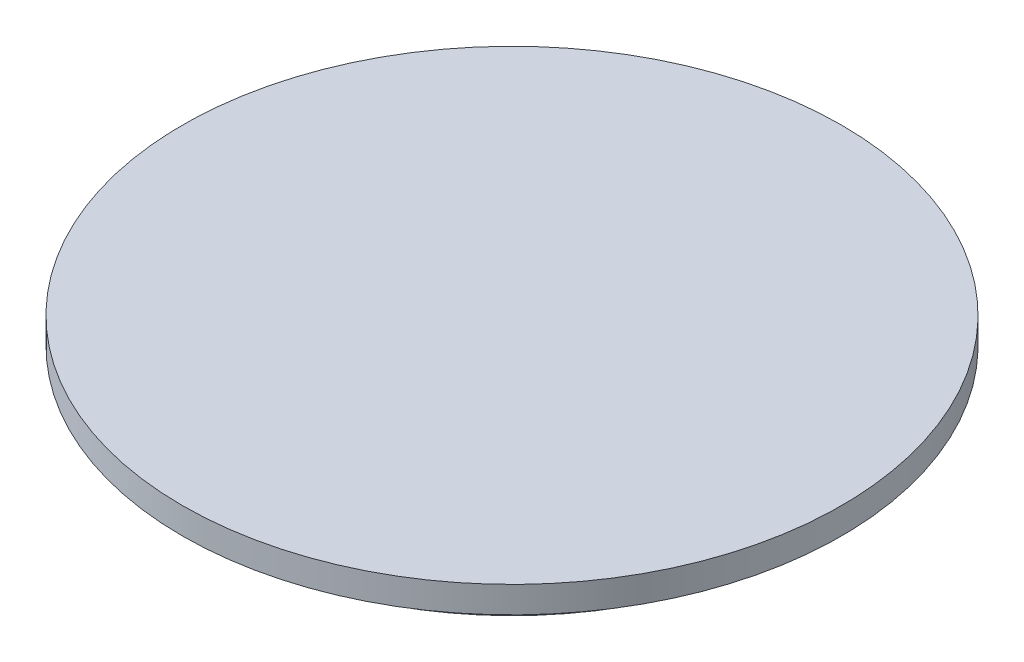
ISO-10303-21;
HEADER;
FILE_DESCRIPTION(('STEP AP214'),'2;1');
FILE_NAME('part.step','',(''),(''),'','','');
FILE_SCHEMA(('AUTOMOTIVE_DESIGN { 1 0 10303 214 1 1 1 1 }'));
ENDSEC;
DATA;
#1=APPLICATION_CONTEXT('core data for automotive mechanical design processes');
#2=APPLICATION_PROTOCOL_DEFINITION('international standard','automotive_design',2000,#1);
#3=PRODUCT_CONTEXT('',#1,'mechanical');
#4=PRODUCT('Part','Part','',(#3));
#5=PRODUCT_RELATED_PRODUCT_CATEGORY('part','',(#4));
#6=PRODUCT_DEFINITION_FORMATION('','',#4);
#7=PRODUCT_DEFINITION_CONTEXT('part definition',#1,'design');
#8=PRODUCT_DEFINITION('design','',#6,#7);
#9=PRODUCT_DEFINITION_SHAPE('','',#8);
#10=(LENGTH_UNIT() NAMED_UNIT(*) SI_UNIT(.MILLI.,.METRE.));
#11=(NAMED_UNIT(*) PLANE_ANGLE_UNIT() SI_UNIT($,.RADIAN.));
#12=(NAMED_UNIT(*) SI_UNIT($,.STERADIAN.) SOLID_ANGLE_UNIT());
#13=UNCERTAINTY_MEASURE_WITH_UNIT(LENGTH_MEASURE(1.E-05),#10,'distance_accuracy_value','');
#14=(GEOMETRIC_REPRESENTATION_CONTEXT(3) GLOBAL_UNCERTAINTY_ASSIGNED_CONTEXT((#13)) GLOBAL_UNIT_ASSIGNED_CONTEXT((#10,
#11,#12)) REPRESENTATION_CONTEXT('',''));
#15=CARTESIAN_POINT('',(0.,0.,0.));
#16=DIRECTION('',(0.,0.,1.));
#17=DIRECTION('',(1.,0.,0.));
#18=AXIS2_PLACEMENT_3D('',#15,#16,#17);
#19=CARTESIAN_POINT('',(0.,0.,0.));
#20=DIRECTION('',(0.,1.,0.));
#21=DIRECTION('',(0.,0.,1.));
#22=AXIS2_PLACEMENT_3D('',#19,#20,#21);
#23=PLANE('',#22);
#24=CARTESIAN_POINT('',(0.,0.,0.));
#25=DIRECTION('',(0.,1.,0.));
#26=DIRECTION('',(0.,0.,1.));
#27=AXIS2_PLACEMENT_3D('',#24,#25,#26);
#28=CIRCLE('',#27,8.9);
#29=CARTESIAN_POINT('',(0.,0.,8.9));
#30=VERTEX_POINT('',#29);
#31=EDGE_CURVE('E10',#30,#30,#28,.T.);
#32=ORIENTED_EDGE('',*,*,#31,.F.);
#33=EDGE_LOOP('',(#32));
#34=FACE_BOUND('',#33,.T.);
#35=ADVANCED_FACE('F35',(#34),#23,.F.);
#36=CARTESIAN_POINT('',(0.,1.6,0.));
#37=DIRECTION('',(0.,1.,0.));
#38=DIRECTION('',(0.,0.,1.));
#39=AXIS2_PLACEMENT_3D('',#36,#37,#38);
#40=CYLINDRICAL_SURFACE('',#39,8.9);
#41=CARTESIAN_POINT('',(0.,0.8,0.));
#42=DIRECTION('',(0.,1.,0.));
#43=DIRECTION('',(0.,0.,1.));
#44=AXIS2_PLACEMENT_3D('',#41,#42,#43);
#45=CIRCLE('',#44,8.9);
#46=CARTESIAN_POINT('',(0.,0.8,8.9));
#47=VERTEX_POINT('',#46);
#48=EDGE_CURVE('E41',#47,#47,#45,.T.);
#49=ORIENTED_EDGE('',*,*,#48,.F.);
#50=EDGE_LOOP('',(#49));
#51=FACE_BOUND('',#50,.T.);
#52=ORIENTED_EDGE('',*,*,#31,.T.);
#53=EDGE_LOOP('',(#52));
#54=FACE_BOUND('',#53,.T.);
#55=ADVANCED_FACE('F65',(#51,#54),#40,.T.);
#56=CARTESIAN_POINT('',(8.9,0.8,0.));
#57=DIRECTION('',(0.,1.,0.));
#58=DIRECTION('',(0.,0.,1.));
#59=AXIS2_PLACEMENT_3D('',#56,#57,#58);
#60=PLANE('',#59);
#61=CARTESIAN_POINT('',(0.,0.8,0.));
#62=DIRECTION('',(0.,1.,0.));
#63=DIRECTION('',(0.,0.,1.));
#64=AXIS2_PLACEMENT_3D('',#61,#62,#63);
#65=CIRCLE('',#64,10.);
#66=CARTESIAN_POINT('',(0.,0.8,10.));
#67=VERTEX_POINT('',#66);
#68=EDGE_CURVE('E45',#67,#67,#65,.T.);
#69=ORIENTED_EDGE('',*,*,#68,.F.);
#70=EDGE_LOOP('',(#69));
#71=FACE_BOUND('',#70,.T.);
#72=ORIENTED_EDGE('',*,*,#48,.T.);
#73=EDGE_LOOP('',(#72));
#74=FACE_BOUND('',#73,.T.);
#75=ADVANCED_FACE('F60',(#71,#74),#60,.F.);
#76=CARTESIAN_POINT('',(0.,1.6,0.));
#77=DIRECTION('',(0.,1.,0.));
#78=DIRECTION('',(0.,0.,1.));
#79=AXIS2_PLACEMENT_3D('',#76,#77,#78);
#80=CYLINDRICAL_SURFACE('',#79,10.);
#81=CARTESIAN_POINT('',(0.,1.6,0.));
#82=DIRECTION('',(0.,1.,0.));
#83=DIRECTION('',(0.,0.,1.));
#84=AXIS2_PLACEMENT_3D('',#81,#82,#83);
#85=CIRCLE('',#84,10.);
#86=CARTESIAN_POINT('',(0.,1.6,10.));
#87=VERTEX_POINT('',#86);
#88=EDGE_CURVE('E49',#87,#87,#85,.T.);
#89=ORIENTED_EDGE('',*,*,#88,.F.);
#90=EDGE_LOOP('',(#89));
#91=FACE_BOUND('',#90,.T.);
#92=ORIENTED_EDGE('',*,*,#68,.T.);
#93=EDGE_LOOP('',(#92));
#94=FACE_BOUND('',#93,.T.);
#95=ADVANCED_FACE('F57',(#91,#94),#80,.T.);
#96=CARTESIAN_POINT('',(10.,1.6,0.));
#97=DIRECTION('',(0.,-1.,0.));
#98=DIRECTION('',(0.,0.,-1.));
#99=AXIS2_PLACEMENT_3D('',#96,#97,#98);
#100=PLANE('',#99);
#101=ORIENTED_EDGE('',*,*,#88,.T.);
#102=EDGE_LOOP('',(#101));
#103=FACE_BOUND('',#102,.T.);
#104=ADVANCED_FACE('F55',(#103),#100,.F.);
#105=CLOSED_SHELL('',(#35,#55,#75,#95,#104));
#106=MANIFOLD_SOLID_BREP('B2',#105);
#107=ADVANCED_BREP_SHAPE_REPRESENTATION('',(#18,#106),#14);
#108=SHAPE_DEFINITION_REPRESENTATION(#9,#107);
ENDSEC;
END-ISO-10303-21;
